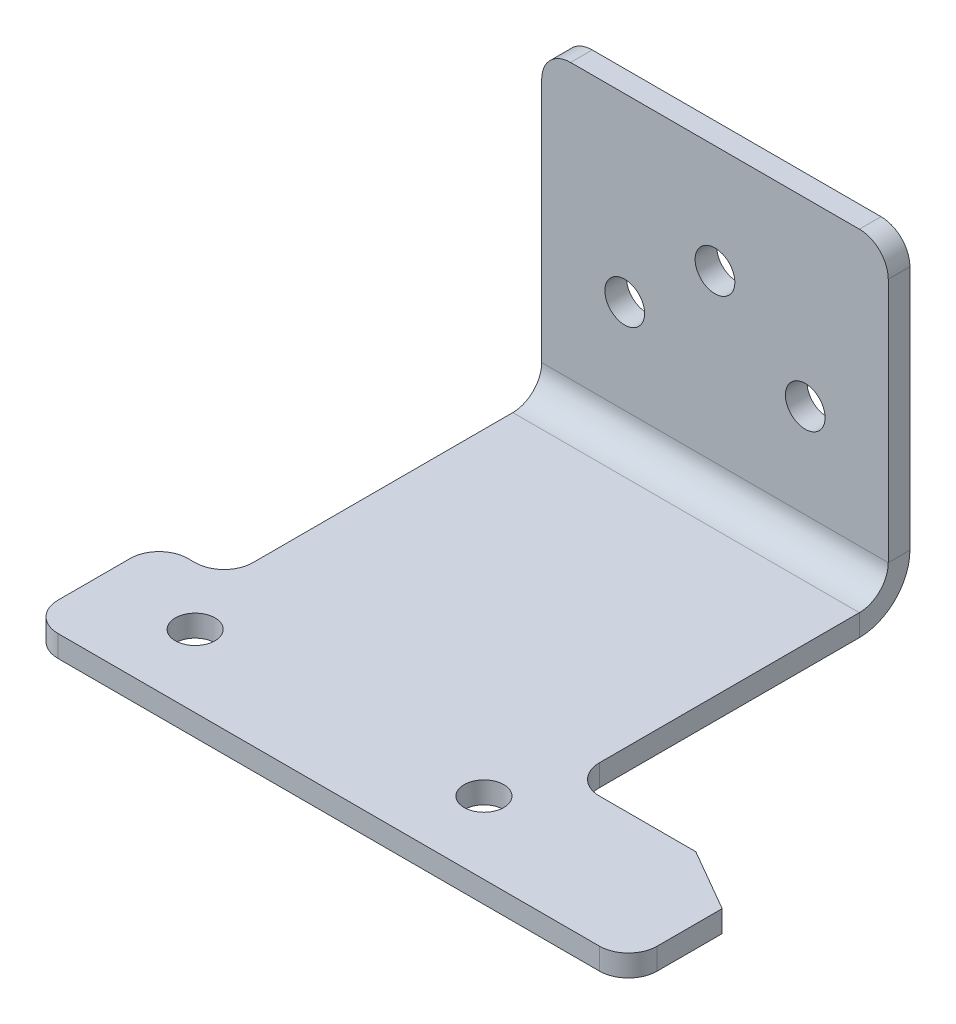
ISO-10303-21;
HEADER;
FILE_DESCRIPTION(('STEP AP214'),'2;1');
FILE_NAME('part.step','',(''),(''),'','','');
FILE_SCHEMA(('AUTOMOTIVE_DESIGN { 1 0 10303 214 1 1 1 1 }'));
ENDSEC;
DATA;
#1=APPLICATION_CONTEXT('core data for automotive mechanical design processes');
#2=APPLICATION_PROTOCOL_DEFINITION('international standard','automotive_design',2000,#1);
#3=PRODUCT_CONTEXT('',#1,'mechanical');
#4=PRODUCT('Part','Part','',(#3));
#5=PRODUCT_RELATED_PRODUCT_CATEGORY('part','',(#4));
#6=PRODUCT_DEFINITION_FORMATION('','',#4);
#7=PRODUCT_DEFINITION_CONTEXT('part definition',#1,'design');
#8=PRODUCT_DEFINITION('design','',#6,#7);
#9=PRODUCT_DEFINITION_SHAPE('','',#8);
#10=(LENGTH_UNIT() NAMED_UNIT(*) SI_UNIT(.MILLI.,.METRE.));
#11=(NAMED_UNIT(*) PLANE_ANGLE_UNIT() SI_UNIT($,.RADIAN.));
#12=(NAMED_UNIT(*) SI_UNIT($,.STERADIAN.) SOLID_ANGLE_UNIT());
#13=UNCERTAINTY_MEASURE_WITH_UNIT(LENGTH_MEASURE(1.E-05),#10,'distance_accuracy_value','');
#14=(GEOMETRIC_REPRESENTATION_CONTEXT(3) GLOBAL_UNCERTAINTY_ASSIGNED_CONTEXT((#13)) GLOBAL_UNIT_ASSIGNED_CONTEXT((#10,
#11,#12)) REPRESENTATION_CONTEXT('',''));
#15=CARTESIAN_POINT('',(0.,0.,0.));
#16=DIRECTION('',(0.,0.,1.));
#17=DIRECTION('',(1.,0.,0.));
#18=AXIS2_PLACEMENT_3D('',#15,#16,#17);
#19=CARTESIAN_POINT('',(24.,45.,0.));
#20=DIRECTION('',(-1.,0.,0.));
#21=DIRECTION('',(0.,0.,1.));
#22=AXIS2_PLACEMENT_3D('',#19,#20,#21);
#23=PLANE('',#22);
#24=DIRECTION('',(0.,-1.,0.));
#25=VECTOR('',#24,1.);
#26=CARTESIAN_POINT('',(24.,45.,0.));
#27=LINE('',#26,#25);
#28=CARTESIAN_POINT('',(24.,41.,0.));
#29=VERTEX_POINT('',#28);
#30=CARTESIAN_POINT('',(24.,7.00000000000001,0.));
#31=VERTEX_POINT('',#30);
#32=EDGE_CURVE('E341',#29,#31,#27,.T.);
#33=ORIENTED_EDGE('',*,*,#32,.F.);
#34=DIRECTION('',(0.,0.,-1.));
#35=VECTOR('',#34,1.);
#36=CARTESIAN_POINT('',(24.,41.,3.));
#37=LINE('',#36,#35);
#38=CARTESIAN_POINT('',(24.,41.,3.));
#39=VERTEX_POINT('',#38);
#40=EDGE_CURVE('E308',#29,#39,#37,.F.);
#41=ORIENTED_EDGE('',*,*,#40,.T.);
#42=DIRECTION('',(0.,1.,0.));
#43=VECTOR('',#42,1.);
#44=CARTESIAN_POINT('',(24.,0.,3.));
#45=LINE('',#44,#43);
#46=CARTESIAN_POINT('',(24.,6.99999999999999,3.));
#47=VERTEX_POINT('',#46);
#48=EDGE_CURVE('E333',#47,#39,#45,.T.);
#49=ORIENTED_EDGE('',*,*,#48,.F.);
#50=DIRECTION('',(0.,0.,-1.));
#51=VECTOR('',#50,1.);
#52=CARTESIAN_POINT('',(24.,6.99999999999999,3.));
#53=LINE('',#52,#51);
#54=EDGE_CURVE('E239',#47,#31,#53,.T.);
#55=ORIENTED_EDGE('',*,*,#54,.T.);
#56=EDGE_LOOP('',(#33,#41,#49,#55));
#57=FACE_BOUND('',#56,.T.);
#58=ADVANCED_FACE('F45',(#57),#23,.F.);
#59=DIRECTION('',(0.,0.,-1.));
#60=VECTOR('',#59,1.);
#61=CARTESIAN_POINT('',(24.,3.,0.));
#62=LINE('',#61,#60);
#63=CARTESIAN_POINT('',(24.,3.,43.));
#64=VERTEX_POINT('',#63);
#65=CARTESIAN_POINT('',(24.,3.,7.));
#66=VERTEX_POINT('',#65);
#67=EDGE_CURVE('E324',#64,#66,#62,.T.);
#68=ORIENTED_EDGE('',*,*,#67,.F.);
#69=DIRECTION('',(0.,-1.,0.));
#70=VECTOR('',#69,1.);
#71=CARTESIAN_POINT('',(24.,0.,43.));
#72=LINE('',#71,#70);
#73=CARTESIAN_POINT('',(24.,0.,43.));
#74=VERTEX_POINT('',#73);
#75=EDGE_CURVE('E287',#64,#74,#72,.T.);
#76=ORIENTED_EDGE('',*,*,#75,.T.);
#77=DIRECTION('',(0.,0.,-1.));
#78=VECTOR('',#77,1.);
#79=CARTESIAN_POINT('',(24.,0.,0.));
#80=LINE('',#79,#78);
#81=CARTESIAN_POINT('',(24.,0.,7.));
#82=VERTEX_POINT('',#81);
#83=EDGE_CURVE('E338',#74,#82,#80,.T.);
#84=ORIENTED_EDGE('',*,*,#83,.T.);
#85=DIRECTION('',(0.,1.,0.));
#86=VECTOR('',#85,1.);
#87=CARTESIAN_POINT('',(24.,0.,7.));
#88=LINE('',#87,#86);
#89=EDGE_CURVE('E187',#82,#66,#88,.T.);
#90=ORIENTED_EDGE('',*,*,#89,.T.);
#91=EDGE_LOOP('',(#68,#76,#84,#90));
#92=FACE_BOUND('',#91,.T.);
#93=ADVANCED_FACE('F326',(#92),#23,.F.);
#94=CARTESIAN_POINT('',(-24.,45.,0.));
#95=DIRECTION('',(1.,0.,0.));
#96=DIRECTION('',(0.,0.,-1.));
#97=AXIS2_PLACEMENT_3D('',#94,#95,#96);
#98=PLANE('',#97);
#99=DIRECTION('',(0.,0.,1.));
#100=VECTOR('',#99,1.);
#101=CARTESIAN_POINT('',(-24.,0.,0.));
#102=LINE('',#101,#100);
#103=CARTESIAN_POINT('',(-24.,0.,7.));
#104=VERTEX_POINT('',#103);
#105=CARTESIAN_POINT('',(-24.,0.,43.));
#106=VERTEX_POINT('',#105);
#107=EDGE_CURVE('E181',#104,#106,#102,.T.);
#108=ORIENTED_EDGE('',*,*,#107,.T.);
#109=DIRECTION('',(0.,-1.,0.));
#110=VECTOR('',#109,1.);
#111=CARTESIAN_POINT('',(-24.,3.00000000000002,43.));
#112=LINE('',#111,#110);
#113=CARTESIAN_POINT('',(-24.,3.,43.));
#114=VERTEX_POINT('',#113);
#115=EDGE_CURVE('E295',#106,#114,#112,.F.);
#116=ORIENTED_EDGE('',*,*,#115,.T.);
#117=DIRECTION('',(0.,0.,1.));
#118=VECTOR('',#117,1.);
#119=CARTESIAN_POINT('',(-24.,3.,0.));
#120=LINE('',#119,#118);
#121=CARTESIAN_POINT('',(-24.,3.,7.));
#122=VERTEX_POINT('',#121);
#123=EDGE_CURVE('E188',#122,#114,#120,.T.);
#124=ORIENTED_EDGE('',*,*,#123,.F.);
#125=DIRECTION('',(0.,-1.,0.));
#126=VECTOR('',#125,1.);
#127=CARTESIAN_POINT('',(-24.,3.,7.));
#128=LINE('',#127,#126);
#129=EDGE_CURVE('E177',#122,#104,#128,.T.);
#130=ORIENTED_EDGE('',*,*,#129,.T.);
#131=EDGE_LOOP('',(#108,#116,#124,#130));
#132=FACE_BOUND('',#131,.T.);
#133=ADVANCED_FACE('F183',(#132),#98,.F.);
#134=DIRECTION('',(0.,-1.,0.));
#135=VECTOR('',#134,1.);
#136=CARTESIAN_POINT('',(-24.,0.,3.));
#137=LINE('',#136,#135);
#138=CARTESIAN_POINT('',(-24.,41.,3.));
#139=VERTEX_POINT('',#138);
#140=CARTESIAN_POINT('',(-24.,7.,3.));
#141=VERTEX_POINT('',#140);
#142=EDGE_CURVE('E355',#139,#141,#137,.T.);
#143=ORIENTED_EDGE('',*,*,#142,.F.);
#144=DIRECTION('',(0.,0.,1.));
#145=VECTOR('',#144,1.);
#146=CARTESIAN_POINT('',(-24.,41.,0.));
#147=LINE('',#146,#145);
#148=CARTESIAN_POINT('',(-24.,41.,0.));
#149=VERTEX_POINT('',#148);
#150=EDGE_CURVE('E65',#139,#149,#147,.F.);
#151=ORIENTED_EDGE('',*,*,#150,.T.);
#152=DIRECTION('',(0.,-1.,0.));
#153=VECTOR('',#152,1.);
#154=CARTESIAN_POINT('',(-24.,45.,0.));
#155=LINE('',#154,#153);
#156=CARTESIAN_POINT('',(-24.,7.00000000000001,0.));
#157=VERTEX_POINT('',#156);
#158=EDGE_CURVE('E348',#149,#157,#155,.T.);
#159=ORIENTED_EDGE('',*,*,#158,.T.);
#160=DIRECTION('',(0.,0.,1.));
#161=VECTOR('',#160,1.);
#162=CARTESIAN_POINT('',(-24.,7.00000000000001,0.));
#163=LINE('',#162,#161);
#164=EDGE_CURVE('E191',#157,#141,#163,.T.);
#165=ORIENTED_EDGE('',*,*,#164,.T.);
#166=EDGE_LOOP('',(#143,#151,#159,#165));
#167=FACE_BOUND('',#166,.T.);
#168=ADVANCED_FACE('F382',(#167),#98,.F.);
#169=CARTESIAN_POINT('',(50.,6.99999999999999,3.));
#170=DIRECTION('',(1.,0.,0.));
#171=DIRECTION('',(0.,0.,-1.));
#172=AXIS2_PLACEMENT_3D('',#169,#170,#171);
#173=PLANE('',#172);
#174=DIRECTION('',(0.,0.,-1.));
#175=VECTOR('',#174,1.);
#176=CARTESIAN_POINT('',(50.,3.,0.));
#177=LINE('',#176,#175);
#178=CARTESIAN_POINT('',(50.,3.,52.));
#179=VERTEX_POINT('',#178);
#180=CARTESIAN_POINT('',(50.,3.,61.));
#181=VERTEX_POINT('',#180);
#182=EDGE_CURVE('E357',#179,#181,#177,.F.);
#183=ORIENTED_EDGE('',*,*,#182,.T.);
#184=DIRECTION('',(0.,1.,0.));
#185=VECTOR('',#184,1.);
#186=CARTESIAN_POINT('',(50.,6.99999999999999,61.));
#187=LINE('',#186,#185);
#188=CARTESIAN_POINT('',(50.,0.,61.));
#189=VERTEX_POINT('',#188);
#190=EDGE_CURVE('E291',#181,#189,#187,.F.);
#191=ORIENTED_EDGE('',*,*,#190,.T.);
#192=DIRECTION('',(0.,0.,1.));
#193=VECTOR('',#192,1.);
#194=CARTESIAN_POINT('',(50.,0.,0.));
#195=LINE('',#194,#193);
#196=CARTESIAN_POINT('',(50.,0.,52.));
#197=VERTEX_POINT('',#196);
#198=EDGE_CURVE('E356',#197,#189,#195,.T.);
#199=ORIENTED_EDGE('',*,*,#198,.F.);
#200=DIRECTION('',(0.,1.,0.));
#201=VECTOR('',#200,1.);
#202=CARTESIAN_POINT('',(50.,3.00000000000002,52.));
#203=LINE('',#202,#201);
#204=EDGE_CURVE('E254',#197,#179,#203,.T.);
#205=ORIENTED_EDGE('',*,*,#204,.T.);
#206=EDGE_LOOP('',(#183,#191,#199,#205));
#207=FACE_BOUND('',#206,.T.);
#208=ADVANCED_FACE('F486',(#207),#173,.T.);
#209=CARTESIAN_POINT('',(50.,3.,0.));
#210=DIRECTION('',(0.,-1.,0.));
#211=DIRECTION('',(0.,0.,-1.));
#212=AXIS2_PLACEMENT_3D('',#209,#210,#211);
#213=PLANE('',#212);
#214=CARTESIAN_POINT('',(-20.,3.,55.));
#215=DIRECTION('',(0.,-1.,0.));
#216=DIRECTION('',(0.,0.,-1.));
#217=AXIS2_PLACEMENT_3D('',#214,#215,#216);
#218=CIRCLE('',#217,2.74999999999999);
#219=CARTESIAN_POINT('',(-20.,3.,52.25));
#220=VERTEX_POINT('',#219);
#221=EDGE_CURVE('E410',#220,#220,#218,.T.);
#222=ORIENTED_EDGE('',*,*,#221,.T.);
#223=EDGE_LOOP('',(#222));
#224=FACE_BOUND('',#223,.T.);
#225=CARTESIAN_POINT('',(20.,3.,55.));
#226=DIRECTION('',(0.,-1.,0.));
#227=DIRECTION('',(0.,0.,-1.));
#228=AXIS2_PLACEMENT_3D('',#225,#226,#227);
#229=CIRCLE('',#228,2.74999999999999);
#230=CARTESIAN_POINT('',(20.,3.,52.25));
#231=VERTEX_POINT('',#230);
#232=EDGE_CURVE('E401',#231,#231,#229,.T.);
#233=ORIENTED_EDGE('',*,*,#232,.T.);
#234=EDGE_LOOP('',(#233));
#235=FACE_BOUND('',#234,.T.);
#236=DIRECTION('',(0.,0.,-1.));
#237=VECTOR('',#236,1.);
#238=CARTESIAN_POINT('',(-33.,3.,65.));
#239=LINE('',#238,#237);
#240=CARTESIAN_POINT('',(-33.,3.,61.));
#241=VERTEX_POINT('',#240);
#242=CARTESIAN_POINT('',(-33.,3.,51.));
#243=VERTEX_POINT('',#242);
#244=EDGE_CURVE('E416',#241,#243,#239,.T.);
#245=ORIENTED_EDGE('',*,*,#244,.F.);
#246=CARTESIAN_POINT('',(-29.,3.,61.));
#247=DIRECTION('',(0.,-1.,0.));
#248=DIRECTION('',(0.,0.,-1.));
#249=AXIS2_PLACEMENT_3D('',#246,#247,#248);
#250=CIRCLE('',#249,4.);
#251=CARTESIAN_POINT('',(-29.,3.,65.));
#252=VERTEX_POINT('',#251);
#253=EDGE_CURVE('E268',#241,#252,#250,.F.);
#254=ORIENTED_EDGE('',*,*,#253,.T.);
#255=DIRECTION('',(-1.,0.,0.));
#256=VECTOR('',#255,1.);
#257=CARTESIAN_POINT('',(50.,3.,65.));
#258=LINE('',#257,#256);
#259=CARTESIAN_POINT('',(46.,3.,65.));
#260=VERTEX_POINT('',#259);
#261=EDGE_CURVE('E225',#260,#252,#258,.T.);
#262=ORIENTED_EDGE('',*,*,#261,.F.);
#263=CARTESIAN_POINT('',(46.,3.,61.));
#264=DIRECTION('',(0.,-1.,0.));
#265=DIRECTION('',(0.,0.,-1.));
#266=AXIS2_PLACEMENT_3D('',#263,#264,#265);
#267=CIRCLE('',#266,4.);
#268=EDGE_CURVE('E264',#260,#181,#267,.F.);
#269=ORIENTED_EDGE('',*,*,#268,.T.);
#270=ORIENTED_EDGE('',*,*,#182,.F.);
#271=DIRECTION('',(-0.866025403784438,0.,-0.500000000000001));
#272=VECTOR('',#271,1.);
#273=CARTESIAN_POINT('',(41.3397459621556,3.,47.));
#274=LINE('',#273,#272);
#275=CARTESIAN_POINT('',(41.3397459621556,3.,47.));
#276=VERTEX_POINT('',#275);
#277=EDGE_CURVE('E257',#179,#276,#274,.T.);
#278=ORIENTED_EDGE('',*,*,#277,.T.);
#279=DIRECTION('',(-1.,0.,0.));
#280=VECTOR('',#279,1.);
#281=CARTESIAN_POINT('',(50.,3.,47.));
#282=LINE('',#281,#280);
#283=CARTESIAN_POINT('',(28.,3.,47.));
#284=VERTEX_POINT('',#283);
#285=EDGE_CURVE('E205',#276,#284,#282,.T.);
#286=ORIENTED_EDGE('',*,*,#285,.T.);
#287=CARTESIAN_POINT('',(28.,3.,43.));
#288=DIRECTION('',(0.,-1.,0.));
#289=DIRECTION('',(0.,0.,-1.));
#290=AXIS2_PLACEMENT_3D('',#287,#288,#289);
#291=CIRCLE('',#290,4.);
#292=EDGE_CURVE('E313',#284,#64,#291,.T.);
#293=ORIENTED_EDGE('',*,*,#292,.T.);
#294=ORIENTED_EDGE('',*,*,#67,.T.);
#295=DIRECTION('',(-1.,0.,0.));
#296=VECTOR('',#295,1.);
#297=CARTESIAN_POINT('',(50.,3.,7.));
#298=LINE('',#297,#296);
#299=EDGE_CURVE('E362',#66,#122,#298,.T.);
#300=ORIENTED_EDGE('',*,*,#299,.T.);
#301=ORIENTED_EDGE('',*,*,#123,.T.);
#302=CARTESIAN_POINT('',(-28.,3.,43.));
#303=DIRECTION('',(0.,-1.,0.));
#304=DIRECTION('',(0.,0.,-1.));
#305=AXIS2_PLACEMENT_3D('',#302,#303,#304);
#306=CIRCLE('',#305,4.);
#307=CARTESIAN_POINT('',(-28.,3.,47.));
#308=VERTEX_POINT('',#307);
#309=EDGE_CURVE('E11',#114,#308,#306,.T.);
#310=ORIENTED_EDGE('',*,*,#309,.T.);
#311=DIRECTION('',(-1.,0.,0.));
#312=VECTOR('',#311,1.);
#313=CARTESIAN_POINT('',(50.,3.,47.));
#314=LINE('',#313,#312);
#315=CARTESIAN_POINT('',(-29.,3.,47.));
#316=VERTEX_POINT('',#315);
#317=EDGE_CURVE('E344',#308,#316,#314,.T.);
#318=ORIENTED_EDGE('',*,*,#317,.T.);
#319=CARTESIAN_POINT('',(-29.,3.,51.));
#320=DIRECTION('',(0.,-1.,0.));
#321=DIRECTION('',(0.,0.,-1.));
#322=AXIS2_PLACEMENT_3D('',#319,#320,#321);
#323=CIRCLE('',#322,4.);
#324=EDGE_CURVE('E266',#316,#243,#323,.F.);
#325=ORIENTED_EDGE('',*,*,#324,.T.);
#326=EDGE_LOOP('',(#245,#254,#262,#269,#270,#278,#286,#293,#294,#300,#301,#310,#318,#325));
#327=FACE_BOUND('',#326,.T.);
#328=ADVANCED_FACE('F318',(#224,#235,#327),#213,.F.);
#329=CARTESIAN_POINT('',(50.,0.,65.));
#330=DIRECTION('',(0.,0.,1.));
#331=DIRECTION('',(1.,0.,0.));
#332=AXIS2_PLACEMENT_3D('',#329,#330,#331);
#333=PLANE('',#332);
#334=ORIENTED_EDGE('',*,*,#261,.T.);
#335=DIRECTION('',(0.,1.,0.));
#336=VECTOR('',#335,1.);
#337=CARTESIAN_POINT('',(-29.,0.,65.));
#338=LINE('',#337,#336);
#339=CARTESIAN_POINT('',(-29.,0.,65.));
#340=VERTEX_POINT('',#339);
#341=EDGE_CURVE('E273',#252,#340,#338,.F.);
#342=ORIENTED_EDGE('',*,*,#341,.T.);
#343=DIRECTION('',(-1.,0.,0.));
#344=VECTOR('',#343,1.);
#345=CARTESIAN_POINT('',(50.,0.,65.));
#346=LINE('',#345,#344);
#347=CARTESIAN_POINT('',(46.,0.,65.));
#348=VERTEX_POINT('',#347);
#349=EDGE_CURVE('E216',#348,#340,#346,.T.);
#350=ORIENTED_EDGE('',*,*,#349,.F.);
#351=DIRECTION('',(0.,1.,0.));
#352=VECTOR('',#351,1.);
#353=CARTESIAN_POINT('',(46.,0.,65.));
#354=LINE('',#353,#352);
#355=EDGE_CURVE('E269',#348,#260,#354,.T.);
#356=ORIENTED_EDGE('',*,*,#355,.T.);
#357=EDGE_LOOP('',(#334,#342,#350,#356));
#358=FACE_BOUND('',#357,.T.);
#359=ADVANCED_FACE('F482',(#358),#333,.T.);
#360=CARTESIAN_POINT('',(50.,0.,0.));
#361=DIRECTION('',(0.,-1.,0.));
#362=DIRECTION('',(0.,0.,-1.));
#363=AXIS2_PLACEMENT_3D('',#360,#361,#362);
#364=PLANE('',#363);
#365=ORIENTED_EDGE('',*,*,#349,.T.);
#366=CARTESIAN_POINT('',(-29.,0.,61.));
#367=DIRECTION('',(0.,-1.,0.));
#368=DIRECTION('',(0.,0.,-1.));
#369=AXIS2_PLACEMENT_3D('',#366,#367,#368);
#370=CIRCLE('',#369,4.);
#371=CARTESIAN_POINT('',(-33.,0.,61.));
#372=VERTEX_POINT('',#371);
#373=EDGE_CURVE('E278',#340,#372,#370,.T.);
#374=ORIENTED_EDGE('',*,*,#373,.T.);
#375=DIRECTION('',(0.,0.,-1.));
#376=VECTOR('',#375,1.);
#377=CARTESIAN_POINT('',(-33.,0.,65.));
#378=LINE('',#377,#376);
#379=CARTESIAN_POINT('',(-33.,0.,51.));
#380=VERTEX_POINT('',#379);
#381=EDGE_CURVE('E412',#372,#380,#378,.T.);
#382=ORIENTED_EDGE('',*,*,#381,.T.);
#383=CARTESIAN_POINT('',(-29.,0.,51.));
#384=DIRECTION('',(0.,-1.,0.));
#385=DIRECTION('',(0.,0.,-1.));
#386=AXIS2_PLACEMENT_3D('',#383,#384,#385);
#387=CIRCLE('',#386,4.);
#388=CARTESIAN_POINT('',(-29.,0.,47.));
#389=VERTEX_POINT('',#388);
#390=EDGE_CURVE('E280',#380,#389,#387,.T.);
#391=ORIENTED_EDGE('',*,*,#390,.T.);
#392=DIRECTION('',(-1.,0.,0.));
#393=VECTOR('',#392,1.);
#394=CARTESIAN_POINT('',(-50.,0.,47.));
#395=LINE('',#394,#393);
#396=CARTESIAN_POINT('',(-28.,0.,47.));
#397=VERTEX_POINT('',#396);
#398=EDGE_CURVE('E212',#397,#389,#395,.T.);
#399=ORIENTED_EDGE('',*,*,#398,.F.);
#400=CARTESIAN_POINT('',(-28.,0.,43.));
#401=DIRECTION('',(0.,-1.,0.));
#402=DIRECTION('',(0.,0.,-1.));
#403=AXIS2_PLACEMENT_3D('',#400,#401,#402);
#404=CIRCLE('',#403,4.);
#405=EDGE_CURVE('E49',#397,#106,#404,.F.);
#406=ORIENTED_EDGE('',*,*,#405,.T.);
#407=ORIENTED_EDGE('',*,*,#107,.F.);
#408=DIRECTION('',(-1.,0.,0.));
#409=VECTOR('',#408,1.);
#410=CARTESIAN_POINT('',(50.,0.,7.));
#411=LINE('',#410,#409);
#412=EDGE_CURVE('E208',#82,#104,#411,.T.);
#413=ORIENTED_EDGE('',*,*,#412,.F.);
#414=ORIENTED_EDGE('',*,*,#83,.F.);
#415=CARTESIAN_POINT('',(28.,0.,43.));
#416=DIRECTION('',(0.,-1.,0.));
#417=DIRECTION('',(0.,0.,-1.));
#418=AXIS2_PLACEMENT_3D('',#415,#416,#417);
#419=CIRCLE('',#418,4.);
#420=CARTESIAN_POINT('',(28.,0.,47.));
#421=VERTEX_POINT('',#420);
#422=EDGE_CURVE('E312',#74,#421,#419,.F.);
#423=ORIENTED_EDGE('',*,*,#422,.T.);
#424=DIRECTION('',(-1.,0.,0.));
#425=VECTOR('',#424,1.);
#426=CARTESIAN_POINT('',(50.,0.,47.));
#427=LINE('',#426,#425);
#428=CARTESIAN_POINT('',(41.3397459621556,0.,47.));
#429=VERTEX_POINT('',#428);
#430=EDGE_CURVE('E214',#429,#421,#427,.T.);
#431=ORIENTED_EDGE('',*,*,#430,.F.);
#432=DIRECTION('',(0.866025403784438,0.,0.500000000000001));
#433=VECTOR('',#432,1.);
#434=CARTESIAN_POINT('',(27.4833395016045,0.,38.9999999999999));
#435=LINE('',#434,#433);
#436=EDGE_CURVE('E251',#429,#197,#435,.T.);
#437=ORIENTED_EDGE('',*,*,#436,.T.);
#438=ORIENTED_EDGE('',*,*,#198,.T.);
#439=CARTESIAN_POINT('',(46.,0.,61.));
#440=DIRECTION('',(0.,-1.,0.));
#441=DIRECTION('',(0.,0.,-1.));
#442=AXIS2_PLACEMENT_3D('',#439,#440,#441);
#443=CIRCLE('',#442,4.);
#444=EDGE_CURVE('E274',#189,#348,#443,.T.);
#445=ORIENTED_EDGE('',*,*,#444,.T.);
#446=EDGE_LOOP('',(#365,#374,#382,#391,#399,#406,#407,#413,#414,#423,#431,#437,#438,#445));
#447=FACE_BOUND('',#446,.T.);
#448=CARTESIAN_POINT('',(-20.,0.,55.));
#449=DIRECTION('',(0.,-1.,0.));
#450=DIRECTION('',(0.,0.,-1.));
#451=AXIS2_PLACEMENT_3D('',#448,#449,#450);
#452=CIRCLE('',#451,2.74999999999999);
#453=CARTESIAN_POINT('',(-20.,0.,52.25));
#454=VERTEX_POINT('',#453);
#455=EDGE_CURVE('E415',#454,#454,#452,.T.);
#456=ORIENTED_EDGE('',*,*,#455,.F.);
#457=EDGE_LOOP('',(#456));
#458=FACE_BOUND('',#457,.T.);
#459=CARTESIAN_POINT('',(20.,0.,55.));
#460=DIRECTION('',(0.,-1.,0.));
#461=DIRECTION('',(0.,0.,-1.));
#462=AXIS2_PLACEMENT_3D('',#459,#460,#461);
#463=CIRCLE('',#462,2.74999999999999);
#464=CARTESIAN_POINT('',(20.,0.,52.25));
#465=VERTEX_POINT('',#464);
#466=EDGE_CURVE('E408',#465,#465,#463,.T.);
#467=ORIENTED_EDGE('',*,*,#466,.F.);
#468=EDGE_LOOP('',(#467));
#469=FACE_BOUND('',#468,.T.);
#470=ADVANCED_FACE('F210',(#447,#458,#469),#364,.T.);
#471=CARTESIAN_POINT('',(50.,7.,7.));
#472=DIRECTION('',(-1.,0.,0.));
#473=DIRECTION('',(0.,0.,1.));
#474=AXIS2_PLACEMENT_3D('',#471,#472,#473);
#475=CYLINDRICAL_SURFACE('',#474,7.);
#476=CARTESIAN_POINT('',(-24.,7.,7.));
#477=DIRECTION('',(1.,0.,0.));
#478=DIRECTION('',(0.,0.,-1.));
#479=AXIS2_PLACEMENT_3D('',#476,#477,#478);
#480=CIRCLE('',#479,7.);
#481=EDGE_CURVE('E194',#157,#104,#480,.F.);
#482=ORIENTED_EDGE('',*,*,#481,.F.);
#483=DIRECTION('',(-1.,0.,0.));
#484=VECTOR('',#483,1.);
#485=CARTESIAN_POINT('',(50.,7.,0.));
#486=LINE('',#485,#484);
#487=EDGE_CURVE('E218',#31,#157,#486,.T.);
#488=ORIENTED_EDGE('',*,*,#487,.F.);
#489=CARTESIAN_POINT('',(24.,7.,7.));
#490=DIRECTION('',(-1.,0.,0.));
#491=DIRECTION('',(0.,0.,1.));
#492=AXIS2_PLACEMENT_3D('',#489,#490,#491);
#493=CIRCLE('',#492,7.);
#494=EDGE_CURVE('E219',#82,#31,#493,.F.);
#495=ORIENTED_EDGE('',*,*,#494,.F.);
#496=ORIENTED_EDGE('',*,*,#412,.T.);
#497=EDGE_LOOP('',(#482,#488,#495,#496));
#498=FACE_BOUND('',#497,.T.);
#499=ADVANCED_FACE('F217',(#498),#475,.T.);
#500=CARTESIAN_POINT('',(50.,0.,0.));
#501=DIRECTION('',(0.,0.,-1.));
#502=DIRECTION('',(-1.,0.,0.));
#503=AXIS2_PLACEMENT_3D('',#500,#501,#502);
#504=PLANE('',#503);
#505=CARTESIAN_POINT('',(0.,30.,0.));
#506=DIRECTION('',(0.,0.,-1.));
#507=DIRECTION('',(-1.,0.,0.));
#508=AXIS2_PLACEMENT_3D('',#505,#506,#507);
#509=CIRCLE('',#508,2.74999999999999);
#510=CARTESIAN_POINT('',(-2.74999999999999,30.,0.));
#511=VERTEX_POINT('',#510);
#512=EDGE_CURVE('E248',#511,#511,#509,.T.);
#513=ORIENTED_EDGE('',*,*,#512,.F.);
#514=EDGE_LOOP('',(#513));
#515=FACE_BOUND('',#514,.T.);
#516=CARTESIAN_POINT('',(12.5,20.,0.));
#517=DIRECTION('',(0.,0.,-1.));
#518=DIRECTION('',(-1.,0.,0.));
#519=AXIS2_PLACEMENT_3D('',#516,#517,#518);
#520=CIRCLE('',#519,2.74999999999999);
#521=CARTESIAN_POINT('',(9.75000000000001,20.,0.));
#522=VERTEX_POINT('',#521);
#523=EDGE_CURVE('E247',#522,#522,#520,.T.);
#524=ORIENTED_EDGE('',*,*,#523,.F.);
#525=EDGE_LOOP('',(#524));
#526=FACE_BOUND('',#525,.T.);
#527=CARTESIAN_POINT('',(-12.5,20.,0.));
#528=DIRECTION('',(0.,0.,-1.));
#529=DIRECTION('',(-1.,0.,0.));
#530=AXIS2_PLACEMENT_3D('',#527,#528,#529);
#531=CIRCLE('',#530,2.74999999999999);
#532=CARTESIAN_POINT('',(-15.25,20.,0.));
#533=VERTEX_POINT('',#532);
#534=EDGE_CURVE('E243',#533,#533,#531,.T.);
#535=ORIENTED_EDGE('',*,*,#534,.F.);
#536=EDGE_LOOP('',(#535));
#537=FACE_BOUND('',#536,.T.);
#538=ORIENTED_EDGE('',*,*,#158,.F.);
#539=CARTESIAN_POINT('',(-20.,41.,0.));
#540=DIRECTION('',(0.,0.,-1.));
#541=DIRECTION('',(-1.,0.,0.));
#542=AXIS2_PLACEMENT_3D('',#539,#540,#541);
#543=CIRCLE('',#542,4.);
#544=CARTESIAN_POINT('',(-20.,45.,0.));
#545=VERTEX_POINT('',#544);
#546=EDGE_CURVE('E306',#149,#545,#543,.T.);
#547=ORIENTED_EDGE('',*,*,#546,.T.);
#548=DIRECTION('',(-1.,0.,0.));
#549=VECTOR('',#548,1.);
#550=CARTESIAN_POINT('',(50.,45.,0.));
#551=LINE('',#550,#549);
#552=CARTESIAN_POINT('',(20.,45.,0.));
#553=VERTEX_POINT('',#552);
#554=EDGE_CURVE('E222',#553,#545,#551,.T.);
#555=ORIENTED_EDGE('',*,*,#554,.F.);
#556=CARTESIAN_POINT('',(20.,41.,0.));
#557=DIRECTION('',(0.,0.,-1.));
#558=DIRECTION('',(-1.,0.,0.));
#559=AXIS2_PLACEMENT_3D('',#556,#557,#558);
#560=CIRCLE('',#559,4.);
#561=EDGE_CURVE('E60',#553,#29,#560,.T.);
#562=ORIENTED_EDGE('',*,*,#561,.T.);
#563=ORIENTED_EDGE('',*,*,#32,.T.);
#564=ORIENTED_EDGE('',*,*,#487,.T.);
#565=EDGE_LOOP('',(#538,#547,#555,#562,#563,#564));
#566=FACE_BOUND('',#565,.T.);
#567=ADVANCED_FACE('F467',(#515,#526,#537,#566),#504,.T.);
#568=CARTESIAN_POINT('',(50.,45.,3.));
#569=DIRECTION('',(0.,1.,0.));
#570=DIRECTION('',(0.,0.,1.));
#571=AXIS2_PLACEMENT_3D('',#568,#569,#570);
#572=PLANE('',#571);
#573=ORIENTED_EDGE('',*,*,#554,.T.);
#574=DIRECTION('',(0.,0.,1.));
#575=VECTOR('',#574,1.);
#576=CARTESIAN_POINT('',(-20.,45.,3.));
#577=LINE('',#576,#575);
#578=CARTESIAN_POINT('',(-20.,45.,3.));
#579=VERTEX_POINT('',#578);
#580=EDGE_CURVE('E297',#545,#579,#577,.T.);
#581=ORIENTED_EDGE('',*,*,#580,.T.);
#582=DIRECTION('',(-1.,0.,0.));
#583=VECTOR('',#582,1.);
#584=CARTESIAN_POINT('',(50.,45.,3.));
#585=LINE('',#584,#583);
#586=CARTESIAN_POINT('',(20.,45.,3.));
#587=VERTEX_POINT('',#586);
#588=EDGE_CURVE('E370',#587,#579,#585,.T.);
#589=ORIENTED_EDGE('',*,*,#588,.F.);
#590=DIRECTION('',(0.,0.,-1.));
#591=VECTOR('',#590,1.);
#592=CARTESIAN_POINT('',(20.,45.,0.));
#593=LINE('',#592,#591);
#594=EDGE_CURVE('E298',#587,#553,#593,.T.);
#595=ORIENTED_EDGE('',*,*,#594,.T.);
#596=EDGE_LOOP('',(#573,#581,#589,#595));
#597=FACE_BOUND('',#596,.T.);
#598=ADVANCED_FACE('F375',(#597),#572,.T.);
#599=CARTESIAN_POINT('',(50.,0.,3.));
#600=DIRECTION('',(0.,0.,-1.));
#601=DIRECTION('',(-1.,0.,0.));
#602=AXIS2_PLACEMENT_3D('',#599,#600,#601);
#603=PLANE('',#602);
#604=CARTESIAN_POINT('',(0.,30.,3.));
#605=DIRECTION('',(0.,0.,-1.));
#606=DIRECTION('',(-1.,0.,0.));
#607=AXIS2_PLACEMENT_3D('',#604,#605,#606);
#608=CIRCLE('',#607,2.74999999999999);
#609=CARTESIAN_POINT('',(-2.74999999999999,30.,3.));
#610=VERTEX_POINT('',#609);
#611=EDGE_CURVE('E249',#610,#610,#608,.T.);
#612=ORIENTED_EDGE('',*,*,#611,.T.);
#613=EDGE_LOOP('',(#612));
#614=FACE_BOUND('',#613,.T.);
#615=CARTESIAN_POINT('',(12.5,20.,3.));
#616=DIRECTION('',(0.,0.,-1.));
#617=DIRECTION('',(-1.,0.,0.));
#618=AXIS2_PLACEMENT_3D('',#615,#616,#617);
#619=CIRCLE('',#618,2.74999999999999);
#620=CARTESIAN_POINT('',(9.75000000000001,20.,3.));
#621=VERTEX_POINT('',#620);
#622=EDGE_CURVE('E245',#621,#621,#619,.T.);
#623=ORIENTED_EDGE('',*,*,#622,.T.);
#624=EDGE_LOOP('',(#623));
#625=FACE_BOUND('',#624,.T.);
#626=CARTESIAN_POINT('',(-12.5,20.,3.));
#627=DIRECTION('',(0.,0.,-1.));
#628=DIRECTION('',(-1.,0.,0.));
#629=AXIS2_PLACEMENT_3D('',#626,#627,#628);
#630=CIRCLE('',#629,2.74999999999999);
#631=CARTESIAN_POINT('',(-15.25,20.,3.));
#632=VERTEX_POINT('',#631);
#633=EDGE_CURVE('E390',#632,#632,#630,.T.);
#634=ORIENTED_EDGE('',*,*,#633,.T.);
#635=EDGE_LOOP('',(#634));
#636=FACE_BOUND('',#635,.T.);
#637=ORIENTED_EDGE('',*,*,#588,.T.);
#638=CARTESIAN_POINT('',(-20.,41.,3.));
#639=DIRECTION('',(0.,0.,-1.));
#640=DIRECTION('',(-1.,0.,0.));
#641=AXIS2_PLACEMENT_3D('',#638,#639,#640);
#642=CIRCLE('',#641,4.);
#643=EDGE_CURVE('E301',#579,#139,#642,.F.);
#644=ORIENTED_EDGE('',*,*,#643,.T.);
#645=ORIENTED_EDGE('',*,*,#142,.T.);
#646=DIRECTION('',(-1.,0.,0.));
#647=VECTOR('',#646,1.);
#648=CARTESIAN_POINT('',(50.,6.99999999999999,3.));
#649=LINE('',#648,#647);
#650=EDGE_CURVE('E363',#47,#141,#649,.T.);
#651=ORIENTED_EDGE('',*,*,#650,.F.);
#652=ORIENTED_EDGE('',*,*,#48,.T.);
#653=CARTESIAN_POINT('',(20.,41.,3.));
#654=DIRECTION('',(0.,0.,-1.));
#655=DIRECTION('',(-1.,0.,0.));
#656=AXIS2_PLACEMENT_3D('',#653,#654,#655);
#657=CIRCLE('',#656,4.);
#658=EDGE_CURVE('E304',#39,#587,#657,.F.);
#659=ORIENTED_EDGE('',*,*,#658,.T.);
#660=EDGE_LOOP('',(#637,#644,#645,#651,#652,#659));
#661=FACE_BOUND('',#660,.T.);
#662=ADVANCED_FACE('F376',(#614,#625,#636,#661),#603,.F.);
#663=CARTESIAN_POINT('',(50.,7.,7.));
#664=DIRECTION('',(-1.,0.,0.));
#665=DIRECTION('',(0.,0.,1.));
#666=AXIS2_PLACEMENT_3D('',#663,#664,#665);
#667=CYLINDRICAL_SURFACE('',#666,4.);
#668=ORIENTED_EDGE('',*,*,#650,.T.);
#669=CARTESIAN_POINT('',(-24.,7.,7.));
#670=DIRECTION('',(1.,0.,0.));
#671=DIRECTION('',(0.,0.,-1.));
#672=AXIS2_PLACEMENT_3D('',#669,#670,#671);
#673=CIRCLE('',#672,4.);
#674=EDGE_CURVE('E231',#141,#122,#673,.F.);
#675=ORIENTED_EDGE('',*,*,#674,.T.);
#676=ORIENTED_EDGE('',*,*,#299,.F.);
#677=CARTESIAN_POINT('',(24.,7.,7.));
#678=DIRECTION('',(-1.,0.,0.));
#679=DIRECTION('',(0.,0.,1.));
#680=AXIS2_PLACEMENT_3D('',#677,#678,#679);
#681=CIRCLE('',#680,4.);
#682=EDGE_CURVE('E228',#66,#47,#681,.F.);
#683=ORIENTED_EDGE('',*,*,#682,.T.);
#684=EDGE_LOOP('',(#668,#675,#676,#683));
#685=FACE_BOUND('',#684,.T.);
#686=ADVANCED_FACE('F384',(#685),#667,.F.);
#687=ORIENTED_EDGE('',*,*,#129,.F.);
#688=ORIENTED_EDGE('',*,*,#674,.F.);
#689=ORIENTED_EDGE('',*,*,#164,.F.);
#690=ORIENTED_EDGE('',*,*,#481,.T.);
#691=EDGE_LOOP('',(#687,#688,#689,#690));
#692=FACE_BOUND('',#691,.T.);
#693=ADVANCED_FACE('F196',(#692),#98,.F.);
#694=CARTESIAN_POINT('',(-50.,45.,47.));
#695=DIRECTION('',(0.,0.,1.));
#696=DIRECTION('',(1.,0.,0.));
#697=AXIS2_PLACEMENT_3D('',#694,#695,#696);
#698=PLANE('',#697);
#699=ORIENTED_EDGE('',*,*,#398,.T.);
#700=DIRECTION('',(0.,1.,0.));
#701=VECTOR('',#700,1.);
#702=CARTESIAN_POINT('',(-29.,45.,47.));
#703=LINE('',#702,#701);
#704=EDGE_CURVE('E281',#389,#316,#703,.T.);
#705=ORIENTED_EDGE('',*,*,#704,.T.);
#706=ORIENTED_EDGE('',*,*,#317,.F.);
#707=DIRECTION('',(0.,-1.,0.));
#708=VECTOR('',#707,1.);
#709=CARTESIAN_POINT('',(-28.,0.,47.));
#710=LINE('',#709,#708);
#711=EDGE_CURVE('E282',#308,#397,#710,.T.);
#712=ORIENTED_EDGE('',*,*,#711,.T.);
#713=EDGE_LOOP('',(#699,#705,#706,#712));
#714=FACE_BOUND('',#713,.T.);
#715=ADVANCED_FACE('F432',(#714),#698,.F.);
#716=CARTESIAN_POINT('',(50.,45.,47.));
#717=DIRECTION('',(0.,0.,1.));
#718=DIRECTION('',(1.,0.,0.));
#719=AXIS2_PLACEMENT_3D('',#716,#717,#718);
#720=PLANE('',#719);
#721=ORIENTED_EDGE('',*,*,#430,.T.);
#722=DIRECTION('',(0.,-1.,0.));
#723=VECTOR('',#722,1.);
#724=CARTESIAN_POINT('',(28.,3.00000000000002,47.));
#725=LINE('',#724,#723);
#726=EDGE_CURVE('E290',#421,#284,#725,.F.);
#727=ORIENTED_EDGE('',*,*,#726,.T.);
#728=ORIENTED_EDGE('',*,*,#285,.F.);
#729=DIRECTION('',(0.,-1.,0.));
#730=VECTOR('',#729,1.);
#731=CARTESIAN_POINT('',(41.3397459621556,0.,47.));
#732=LINE('',#731,#730);
#733=EDGE_CURVE('E242',#276,#429,#732,.T.);
#734=ORIENTED_EDGE('',*,*,#733,.T.);
#735=EDGE_LOOP('',(#721,#727,#728,#734));
#736=FACE_BOUND('',#735,.T.);
#737=ADVANCED_FACE('F336',(#736),#720,.F.);
#738=ORIENTED_EDGE('',*,*,#54,.F.);
#739=ORIENTED_EDGE('',*,*,#682,.F.);
#740=ORIENTED_EDGE('',*,*,#89,.F.);
#741=ORIENTED_EDGE('',*,*,#494,.T.);
#742=EDGE_LOOP('',(#738,#739,#740,#741));
#743=FACE_BOUND('',#742,.T.);
#744=ADVANCED_FACE('F446',(#743),#23,.F.);
#745=CARTESIAN_POINT('',(-12.5,20.,0.));
#746=DIRECTION('',(0.,0.,-1.));
#747=DIRECTION('',(-1.,0.,0.));
#748=AXIS2_PLACEMENT_3D('',#745,#746,#747);
#749=CYLINDRICAL_SURFACE('',#748,2.74999999999999);
#750=ORIENTED_EDGE('',*,*,#534,.T.);
#751=EDGE_LOOP('',(#750));
#752=FACE_BOUND('',#751,.T.);
#753=ORIENTED_EDGE('',*,*,#633,.F.);
#754=EDGE_LOOP('',(#753));
#755=FACE_BOUND('',#754,.T.);
#756=ADVANCED_FACE('F457',(#752,#755),#749,.F.);
#757=CARTESIAN_POINT('',(12.5,20.,0.));
#758=DIRECTION('',(0.,0.,-1.));
#759=DIRECTION('',(-1.,0.,0.));
#760=AXIS2_PLACEMENT_3D('',#757,#758,#759);
#761=CYLINDRICAL_SURFACE('',#760,2.74999999999999);
#762=ORIENTED_EDGE('',*,*,#523,.T.);
#763=EDGE_LOOP('',(#762));
#764=FACE_BOUND('',#763,.T.);
#765=ORIENTED_EDGE('',*,*,#622,.F.);
#766=EDGE_LOOP('',(#765));
#767=FACE_BOUND('',#766,.T.);
#768=ADVANCED_FACE('F462',(#764,#767),#761,.F.);
#769=CARTESIAN_POINT('',(0.,30.,0.));
#770=DIRECTION('',(0.,0.,-1.));
#771=DIRECTION('',(-1.,0.,0.));
#772=AXIS2_PLACEMENT_3D('',#769,#770,#771);
#773=CYLINDRICAL_SURFACE('',#772,2.74999999999999);
#774=ORIENTED_EDGE('',*,*,#512,.T.);
#775=EDGE_LOOP('',(#774));
#776=FACE_BOUND('',#775,.T.);
#777=ORIENTED_EDGE('',*,*,#611,.F.);
#778=EDGE_LOOP('',(#777));
#779=FACE_BOUND('',#778,.T.);
#780=ADVANCED_FACE('F580',(#776,#779),#773,.F.);
#781=CARTESIAN_POINT('',(20.,0.,55.));
#782=DIRECTION('',(0.,-1.,0.));
#783=DIRECTION('',(0.,0.,-1.));
#784=AXIS2_PLACEMENT_3D('',#781,#782,#783);
#785=CYLINDRICAL_SURFACE('',#784,2.74999999999999);
#786=ORIENTED_EDGE('',*,*,#466,.T.);
#787=EDGE_LOOP('',(#786));
#788=FACE_BOUND('',#787,.T.);
#789=ORIENTED_EDGE('',*,*,#232,.F.);
#790=EDGE_LOOP('',(#789));
#791=FACE_BOUND('',#790,.T.);
#792=ADVANCED_FACE('F568',(#788,#791),#785,.F.);
#793=CARTESIAN_POINT('',(-20.,0.,55.));
#794=DIRECTION('',(0.,-1.,0.));
#795=DIRECTION('',(0.,0.,-1.));
#796=AXIS2_PLACEMENT_3D('',#793,#794,#795);
#797=CYLINDRICAL_SURFACE('',#796,2.74999999999999);
#798=ORIENTED_EDGE('',*,*,#455,.T.);
#799=EDGE_LOOP('',(#798));
#800=FACE_BOUND('',#799,.T.);
#801=ORIENTED_EDGE('',*,*,#221,.F.);
#802=EDGE_LOOP('',(#801));
#803=FACE_BOUND('',#802,.T.);
#804=ADVANCED_FACE('F556',(#800,#803),#797,.F.);
#805=CARTESIAN_POINT('',(-33.,0.,65.));
#806=DIRECTION('',(1.,0.,0.));
#807=DIRECTION('',(0.,0.,-1.));
#808=AXIS2_PLACEMENT_3D('',#805,#806,#807);
#809=PLANE('',#808);
#810=ORIENTED_EDGE('',*,*,#381,.F.);
#811=DIRECTION('',(0.,1.,0.));
#812=VECTOR('',#811,1.);
#813=CARTESIAN_POINT('',(-33.,3.,61.));
#814=LINE('',#813,#812);
#815=EDGE_CURVE('E263',#372,#241,#814,.T.);
#816=ORIENTED_EDGE('',*,*,#815,.T.);
#817=ORIENTED_EDGE('',*,*,#244,.T.);
#818=DIRECTION('',(0.,1.,0.));
#819=VECTOR('',#818,1.);
#820=CARTESIAN_POINT('',(-33.,0.,51.));
#821=LINE('',#820,#819);
#822=EDGE_CURVE('E260',#243,#380,#821,.F.);
#823=ORIENTED_EDGE('',*,*,#822,.T.);
#824=EDGE_LOOP('',(#810,#816,#817,#823));
#825=FACE_BOUND('',#824,.T.);
#826=ADVANCED_FACE('F497',(#825),#809,.F.);
#827=CARTESIAN_POINT('',(41.3397459621556,45.,47.));
#828=DIRECTION('',(0.500000000000001,0.,-0.866025403784438));
#829=DIRECTION('',(0.,1.,0.));
#830=AXIS2_PLACEMENT_3D('',#827,#828,#829);
#831=PLANE('',#830);
#832=ORIENTED_EDGE('',*,*,#277,.F.);
#833=ORIENTED_EDGE('',*,*,#204,.F.);
#834=ORIENTED_EDGE('',*,*,#436,.F.);
#835=ORIENTED_EDGE('',*,*,#733,.F.);
#836=EDGE_LOOP('',(#832,#833,#834,#835));
#837=FACE_BOUND('',#836,.T.);
#838=ADVANCED_FACE('F492',(#837),#831,.T.);
#839=CARTESIAN_POINT('',(-29.,0.,61.));
#840=DIRECTION('',(0.,-1.,0.));
#841=DIRECTION('',(0.,0.,-1.));
#842=AXIS2_PLACEMENT_3D('',#839,#840,#841);
#843=CYLINDRICAL_SURFACE('',#842,4.);
#844=ORIENTED_EDGE('',*,*,#373,.F.);
#845=ORIENTED_EDGE('',*,*,#341,.F.);
#846=ORIENTED_EDGE('',*,*,#253,.F.);
#847=ORIENTED_EDGE('',*,*,#815,.F.);
#848=EDGE_LOOP('',(#844,#845,#846,#847));
#849=FACE_BOUND('',#848,.T.);
#850=ADVANCED_FACE('F498',(#849),#843,.T.);
#851=CARTESIAN_POINT('',(-29.,45.,51.));
#852=DIRECTION('',(0.,1.,0.));
#853=DIRECTION('',(0.,0.,1.));
#854=AXIS2_PLACEMENT_3D('',#851,#852,#853);
#855=CYLINDRICAL_SURFACE('',#854,4.);
#856=ORIENTED_EDGE('',*,*,#390,.F.);
#857=ORIENTED_EDGE('',*,*,#822,.F.);
#858=ORIENTED_EDGE('',*,*,#324,.F.);
#859=ORIENTED_EDGE('',*,*,#704,.F.);
#860=EDGE_LOOP('',(#856,#857,#858,#859));
#861=FACE_BOUND('',#860,.T.);
#862=ADVANCED_FACE('F427',(#861),#855,.T.);
#863=CARTESIAN_POINT('',(28.,45.,43.));
#864=DIRECTION('',(0.,1.,0.));
#865=DIRECTION('',(0.,0.,1.));
#866=AXIS2_PLACEMENT_3D('',#863,#864,#865);
#867=CYLINDRICAL_SURFACE('',#866,4.);
#868=ORIENTED_EDGE('',*,*,#292,.F.);
#869=ORIENTED_EDGE('',*,*,#726,.F.);
#870=ORIENTED_EDGE('',*,*,#422,.F.);
#871=ORIENTED_EDGE('',*,*,#75,.F.);
#872=EDGE_LOOP('',(#868,#869,#870,#871));
#873=FACE_BOUND('',#872,.T.);
#874=ADVANCED_FACE('F331',(#873),#867,.F.);
#875=CARTESIAN_POINT('',(-28.,45.,43.));
#876=DIRECTION('',(0.,1.,0.));
#877=DIRECTION('',(0.,0.,1.));
#878=AXIS2_PLACEMENT_3D('',#875,#876,#877);
#879=CYLINDRICAL_SURFACE('',#878,4.);
#880=ORIENTED_EDGE('',*,*,#309,.F.);
#881=ORIENTED_EDGE('',*,*,#115,.F.);
#882=ORIENTED_EDGE('',*,*,#405,.F.);
#883=ORIENTED_EDGE('',*,*,#711,.F.);
#884=EDGE_LOOP('',(#880,#881,#882,#883));
#885=FACE_BOUND('',#884,.T.);
#886=ADVANCED_FACE('F433',(#885),#879,.F.);
#887=CARTESIAN_POINT('',(46.,0.,61.));
#888=DIRECTION('',(0.,1.,0.));
#889=DIRECTION('',(0.,0.,1.));
#890=AXIS2_PLACEMENT_3D('',#887,#888,#889);
#891=CYLINDRICAL_SURFACE('',#890,4.);
#892=ORIENTED_EDGE('',*,*,#444,.F.);
#893=ORIENTED_EDGE('',*,*,#190,.F.);
#894=ORIENTED_EDGE('',*,*,#268,.F.);
#895=ORIENTED_EDGE('',*,*,#355,.F.);
#896=EDGE_LOOP('',(#892,#893,#894,#895));
#897=FACE_BOUND('',#896,.T.);
#898=ADVANCED_FACE('F437',(#897),#891,.T.);
#899=CARTESIAN_POINT('',(-20.,41.,3.));
#900=DIRECTION('',(0.,0.,-1.));
#901=DIRECTION('',(-1.,0.,0.));
#902=AXIS2_PLACEMENT_3D('',#899,#900,#901);
#903=CYLINDRICAL_SURFACE('',#902,4.);
#904=ORIENTED_EDGE('',*,*,#546,.F.);
#905=ORIENTED_EDGE('',*,*,#150,.F.);
#906=ORIENTED_EDGE('',*,*,#643,.F.);
#907=ORIENTED_EDGE('',*,*,#580,.F.);
#908=EDGE_LOOP('',(#904,#905,#906,#907));
#909=FACE_BOUND('',#908,.T.);
#910=ADVANCED_FACE('F379',(#909),#903,.T.);
#911=CARTESIAN_POINT('',(20.,41.,3.));
#912=DIRECTION('',(0.,0.,1.));
#913=DIRECTION('',(1.,0.,0.));
#914=AXIS2_PLACEMENT_3D('',#911,#912,#913);
#915=CYLINDRICAL_SURFACE('',#914,4.);
#916=ORIENTED_EDGE('',*,*,#658,.F.);
#917=ORIENTED_EDGE('',*,*,#40,.F.);
#918=ORIENTED_EDGE('',*,*,#561,.F.);
#919=ORIENTED_EDGE('',*,*,#594,.F.);
#920=EDGE_LOOP('',(#916,#917,#918,#919));
#921=FACE_BOUND('',#920,.T.);
#922=ADVANCED_FACE('F42',(#921),#915,.T.);
#923=CLOSED_SHELL('',(#58,#93,#133,#168,#208,#328,#359,#470,#499,#567,#598,#662,#686,#693,#715,
#737,#744,#756,#768,#780,#792,#804,#826,#838,#850,#862,#874,#886,#898,#910,#922));
#924=MANIFOLD_SOLID_BREP('B2',#923);
#925=ADVANCED_BREP_SHAPE_REPRESENTATION('',(#18,#924),#14);
#926=SHAPE_DEFINITION_REPRESENTATION(#9,#925);
ENDSEC;
END-ISO-10303-21;
